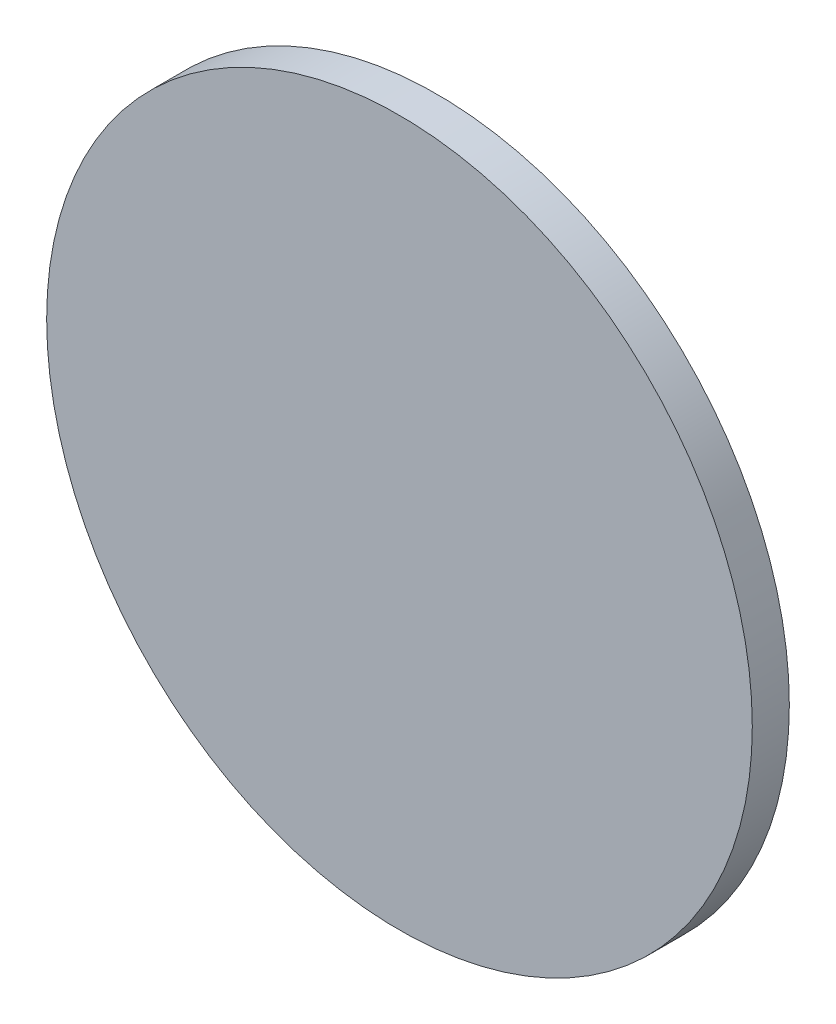
ISO-10303-21;
HEADER;
FILE_DESCRIPTION(('STEP AP214'),'2;1');
FILE_NAME('part.step','',(''),(''),'','','');
FILE_SCHEMA(('AUTOMOTIVE_DESIGN { 1 0 10303 214 1 1 1 1 }'));
ENDSEC;
DATA;
#1=APPLICATION_CONTEXT('core data for automotive mechanical design processes');
#2=APPLICATION_PROTOCOL_DEFINITION('international standard','automotive_design',2000,#1);
#3=PRODUCT_CONTEXT('',#1,'mechanical');
#4=PRODUCT('Part','Part','',(#3));
#5=PRODUCT_RELATED_PRODUCT_CATEGORY('part','',(#4));
#6=PRODUCT_DEFINITION_FORMATION('','',#4);
#7=PRODUCT_DEFINITION_CONTEXT('part definition',#1,'design');
#8=PRODUCT_DEFINITION('design','',#6,#7);
#9=PRODUCT_DEFINITION_SHAPE('','',#8);
#10=(LENGTH_UNIT() NAMED_UNIT(*) SI_UNIT(.MILLI.,.METRE.));
#11=(NAMED_UNIT(*) PLANE_ANGLE_UNIT() SI_UNIT($,.RADIAN.));
#12=(NAMED_UNIT(*) SI_UNIT($,.STERADIAN.) SOLID_ANGLE_UNIT());
#13=UNCERTAINTY_MEASURE_WITH_UNIT(LENGTH_MEASURE(1.E-05),#10,'distance_accuracy_value','');
#14=(GEOMETRIC_REPRESENTATION_CONTEXT(3) GLOBAL_UNCERTAINTY_ASSIGNED_CONTEXT((#13)) GLOBAL_UNIT_ASSIGNED_CONTEXT((#10,
#11,#12)) REPRESENTATION_CONTEXT('',''));
#15=CARTESIAN_POINT('',(0.,0.,0.));
#16=DIRECTION('',(0.,0.,1.));
#17=DIRECTION('',(1.,0.,0.));
#18=AXIS2_PLACEMENT_3D('',#15,#16,#17);
#19=CARTESIAN_POINT('',(0.,0.,1.));
#20=DIRECTION('',(0.,0.,-1.));
#21=DIRECTION('',(-1.,0.,0.));
#22=AXIS2_PLACEMENT_3D('',#19,#20,#21);
#23=CYLINDRICAL_SURFACE('',#22,9.525);
#24=CARTESIAN_POINT('',(0.,0.,1.));
#25=DIRECTION('',(0.,0.,1.));
#26=DIRECTION('',(1.,0.,0.));
#27=AXIS2_PLACEMENT_3D('',#24,#25,#26);
#28=CIRCLE('',#27,9.525);
#29=CARTESIAN_POINT('',(9.525,0.,1.));
#30=VERTEX_POINT('',#29);
#31=EDGE_CURVE('E10',#30,#30,#28,.T.);
#32=ORIENTED_EDGE('',*,*,#31,.F.);
#33=EDGE_LOOP('',(#32));
#34=FACE_BOUND('',#33,.T.);
#35=CARTESIAN_POINT('',(0.,0.,0.));
#36=DIRECTION('',(0.,0.,1.));
#37=DIRECTION('',(1.,0.,0.));
#38=AXIS2_PLACEMENT_3D('',#35,#36,#37);
#39=CIRCLE('',#38,9.525);
#40=CARTESIAN_POINT('',(9.525,0.,0.));
#41=VERTEX_POINT('',#40);
#42=EDGE_CURVE('E33',#41,#41,#39,.T.);
#43=ORIENTED_EDGE('',*,*,#42,.T.);
#44=EDGE_LOOP('',(#43));
#45=FACE_BOUND('',#44,.T.);
#46=ADVANCED_FACE('F30',(#34,#45),#23,.T.);
#47=CARTESIAN_POINT('',(0.,0.,1.));
#48=DIRECTION('',(0.,0.,1.));
#49=DIRECTION('',(1.,0.,0.));
#50=AXIS2_PLACEMENT_3D('',#47,#48,#49);
#51=PLANE('',#50);
#52=ORIENTED_EDGE('',*,*,#31,.T.);
#53=EDGE_LOOP('',(#52));
#54=FACE_BOUND('',#53,.T.);
#55=ADVANCED_FACE('F45',(#54),#51,.T.);
#56=CARTESIAN_POINT('',(0.,0.,0.));
#57=DIRECTION('',(0.,0.,1.));
#58=DIRECTION('',(1.,0.,0.));
#59=AXIS2_PLACEMENT_3D('',#56,#57,#58);
#60=PLANE('',#59);
#61=ORIENTED_EDGE('',*,*,#42,.F.);
#62=EDGE_LOOP('',(#61));
#63=FACE_BOUND('',#62,.T.);
#64=ADVANCED_FACE('F43',(#63),#60,.F.);
#65=CLOSED_SHELL('',(#46,#55,#64));
#66=MANIFOLD_SOLID_BREP('B2',#65);
#67=ADVANCED_BREP_SHAPE_REPRESENTATION('',(#18,#66),#14);
#68=SHAPE_DEFINITION_REPRESENTATION(#9,#67);
ENDSEC;
END-ISO-10303-21;
